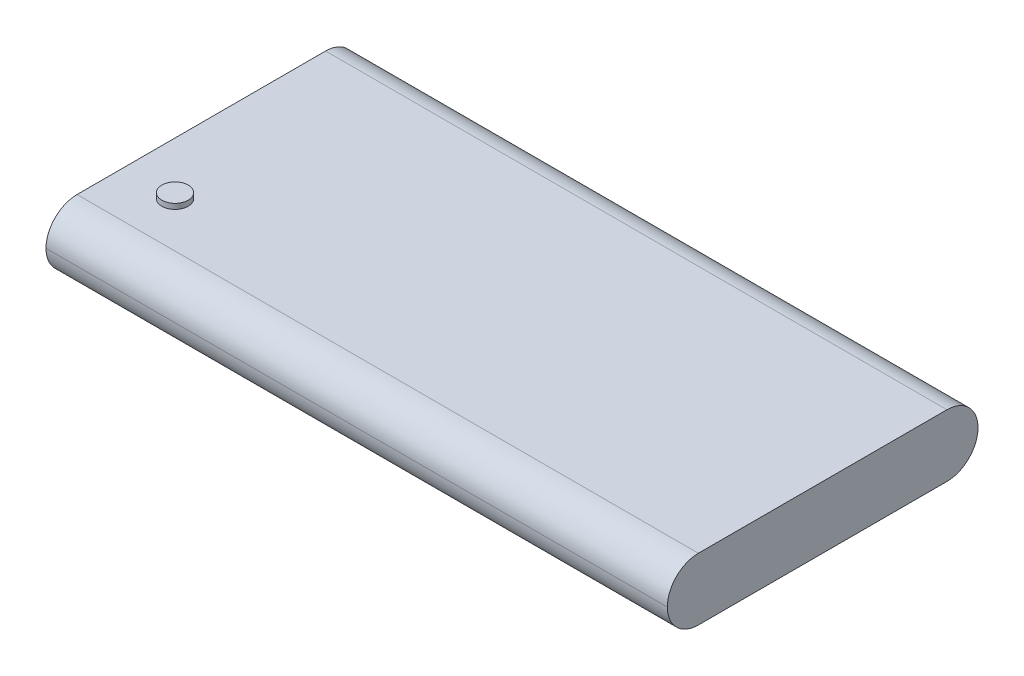
ISO-10303-21;
HEADER;
FILE_DESCRIPTION(('STEP AP214'),'2;1');
FILE_NAME('part.step','',(''),(''),'','','');
FILE_SCHEMA(('AUTOMOTIVE_DESIGN { 1 0 10303 214 1 1 1 1 }'));
ENDSEC;
DATA;
#1=APPLICATION_CONTEXT('core data for automotive mechanical design processes');
#2=APPLICATION_PROTOCOL_DEFINITION('international standard','automotive_design',2000,#1);
#3=PRODUCT_CONTEXT('',#1,'mechanical');
#4=PRODUCT('Part','Part','',(#3));
#5=PRODUCT_RELATED_PRODUCT_CATEGORY('part','',(#4));
#6=PRODUCT_DEFINITION_FORMATION('','',#4);
#7=PRODUCT_DEFINITION_CONTEXT('part definition',#1,'design');
#8=PRODUCT_DEFINITION('design','',#6,#7);
#9=PRODUCT_DEFINITION_SHAPE('','',#8);
#10=(LENGTH_UNIT() NAMED_UNIT(*) SI_UNIT(.MILLI.,.METRE.));
#11=(NAMED_UNIT(*) PLANE_ANGLE_UNIT() SI_UNIT($,.RADIAN.));
#12=(NAMED_UNIT(*) SI_UNIT($,.STERADIAN.) SOLID_ANGLE_UNIT());
#13=UNCERTAINTY_MEASURE_WITH_UNIT(LENGTH_MEASURE(1.E-05),#10,'distance_accuracy_value','');
#14=(GEOMETRIC_REPRESENTATION_CONTEXT(3) GLOBAL_UNCERTAINTY_ASSIGNED_CONTEXT((#13)) GLOBAL_UNIT_ASSIGNED_CONTEXT((#10,
#11,#12)) REPRESENTATION_CONTEXT('',''));
#15=CARTESIAN_POINT('',(0.,0.,0.));
#16=DIRECTION('',(0.,0.,1.));
#17=DIRECTION('',(1.,0.,0.));
#18=AXIS2_PLACEMENT_3D('',#15,#16,#17);
#19=CARTESIAN_POINT('',(75.,7.5,37.5));
#20=DIRECTION('',(-1.,0.,0.));
#21=DIRECTION('',(0.,0.,1.));
#22=AXIS2_PLACEMENT_3D('',#19,#20,#21);
#23=PLANE('',#22);
#24=DIRECTION('',(0.,0.,-1.));
#25=VECTOR('',#24,1.);
#26=CARTESIAN_POINT('',(75.,-7.5,37.5));
#27=LINE('',#26,#25);
#28=CARTESIAN_POINT('',(75.,-7.5,30.));
#29=VERTEX_POINT('',#28);
#30=CARTESIAN_POINT('',(75.,-7.5,-30.));
#31=VERTEX_POINT('',#30);
#32=EDGE_CURVE('E108',#29,#31,#27,.T.);
#33=ORIENTED_EDGE('',*,*,#32,.T.);
#34=CARTESIAN_POINT('',(75.,0.,-30.));
#35=DIRECTION('',(-1.,0.,0.));
#36=DIRECTION('',(0.,0.,1.));
#37=AXIS2_PLACEMENT_3D('',#34,#35,#36);
#38=CIRCLE('',#37,7.5);
#39=CARTESIAN_POINT('',(75.,0.,-37.5));
#40=VERTEX_POINT('',#39);
#41=EDGE_CURVE('E111',#31,#40,#38,.F.);
#42=ORIENTED_EDGE('',*,*,#41,.T.);
#43=CARTESIAN_POINT('',(75.,0.,-30.));
#44=DIRECTION('',(-1.,0.,0.));
#45=DIRECTION('',(0.,0.,1.));
#46=AXIS2_PLACEMENT_3D('',#43,#44,#45);
#47=CIRCLE('',#46,7.5);
#48=CARTESIAN_POINT('',(75.,7.5,-30.));
#49=VERTEX_POINT('',#48);
#50=EDGE_CURVE('E54',#40,#49,#47,.F.);
#51=ORIENTED_EDGE('',*,*,#50,.T.);
#52=DIRECTION('',(0.,0.,-1.));
#53=VECTOR('',#52,1.);
#54=CARTESIAN_POINT('',(75.,7.5,37.5));
#55=LINE('',#54,#53);
#56=CARTESIAN_POINT('',(75.,7.5,30.));
#57=VERTEX_POINT('',#56);
#58=EDGE_CURVE('E107',#57,#49,#55,.T.);
#59=ORIENTED_EDGE('',*,*,#58,.F.);
#60=CARTESIAN_POINT('',(75.,0.,30.));
#61=DIRECTION('',(-1.,0.,0.));
#62=DIRECTION('',(0.,0.,1.));
#63=AXIS2_PLACEMENT_3D('',#60,#61,#62);
#64=CIRCLE('',#63,7.5);
#65=CARTESIAN_POINT('',(75.,0.,37.5));
#66=VERTEX_POINT('',#65);
#67=EDGE_CURVE('E48',#57,#66,#64,.F.);
#68=ORIENTED_EDGE('',*,*,#67,.T.);
#69=CARTESIAN_POINT('',(75.,0.,30.));
#70=DIRECTION('',(-1.,0.,0.));
#71=DIRECTION('',(0.,0.,1.));
#72=AXIS2_PLACEMENT_3D('',#69,#70,#71);
#73=CIRCLE('',#72,7.5);
#74=EDGE_CURVE('E113',#66,#29,#73,.F.);
#75=ORIENTED_EDGE('',*,*,#74,.T.);
#76=EDGE_LOOP('',(#33,#42,#51,#59,#68,#75));
#77=FACE_BOUND('',#76,.T.);
#78=ADVANCED_FACE('F33',(#77),#23,.F.);
#79=CARTESIAN_POINT('',(-75.,7.5,37.5));
#80=DIRECTION('',(1.,0.,0.));
#81=DIRECTION('',(0.,0.,-1.));
#82=AXIS2_PLACEMENT_3D('',#79,#80,#81);
#83=PLANE('',#82);
#84=CARTESIAN_POINT('',(-75.,0.,-30.));
#85=DIRECTION('',(1.,0.,0.));
#86=DIRECTION('',(0.,0.,-1.));
#87=AXIS2_PLACEMENT_3D('',#84,#85,#86);
#88=CIRCLE('',#87,7.5);
#89=CARTESIAN_POINT('',(-75.,7.5,-30.));
#90=VERTEX_POINT('',#89);
#91=CARTESIAN_POINT('',(-75.,0.,-37.5));
#92=VERTEX_POINT('',#91);
#93=EDGE_CURVE('E92',#90,#92,#88,.F.);
#94=ORIENTED_EDGE('',*,*,#93,.T.);
#95=CARTESIAN_POINT('',(-75.,0.,-30.));
#96=DIRECTION('',(1.,0.,0.));
#97=DIRECTION('',(0.,0.,-1.));
#98=AXIS2_PLACEMENT_3D('',#95,#96,#97);
#99=CIRCLE('',#98,7.5);
#100=CARTESIAN_POINT('',(-75.,-7.5,-30.));
#101=VERTEX_POINT('',#100);
#102=EDGE_CURVE('E86',#92,#101,#99,.F.);
#103=ORIENTED_EDGE('',*,*,#102,.T.);
#104=DIRECTION('',(0.,0.,1.));
#105=VECTOR('',#104,1.);
#106=CARTESIAN_POINT('',(-75.,-7.5,37.5));
#107=LINE('',#106,#105);
#108=CARTESIAN_POINT('',(-75.,-7.5,30.));
#109=VERTEX_POINT('',#108);
#110=EDGE_CURVE('E89',#101,#109,#107,.T.);
#111=ORIENTED_EDGE('',*,*,#110,.T.);
#112=CARTESIAN_POINT('',(-75.,0.,30.));
#113=DIRECTION('',(1.,0.,0.));
#114=DIRECTION('',(0.,0.,-1.));
#115=AXIS2_PLACEMENT_3D('',#112,#113,#114);
#116=CIRCLE('',#115,7.5);
#117=CARTESIAN_POINT('',(-75.,0.,37.5));
#118=VERTEX_POINT('',#117);
#119=EDGE_CURVE('E141',#109,#118,#116,.F.);
#120=ORIENTED_EDGE('',*,*,#119,.T.);
#121=CARTESIAN_POINT('',(-75.,0.,30.));
#122=DIRECTION('',(1.,0.,0.));
#123=DIRECTION('',(0.,0.,-1.));
#124=AXIS2_PLACEMENT_3D('',#121,#122,#123);
#125=CIRCLE('',#124,7.5);
#126=CARTESIAN_POINT('',(-75.,7.5,30.));
#127=VERTEX_POINT('',#126);
#128=EDGE_CURVE('E138',#118,#127,#125,.F.);
#129=ORIENTED_EDGE('',*,*,#128,.T.);
#130=DIRECTION('',(0.,0.,1.));
#131=VECTOR('',#130,1.);
#132=CARTESIAN_POINT('',(-75.,7.5,37.5));
#133=LINE('',#132,#131);
#134=EDGE_CURVE('E135',#90,#127,#133,.T.);
#135=ORIENTED_EDGE('',*,*,#134,.F.);
#136=EDGE_LOOP('',(#94,#103,#111,#120,#129,#135));
#137=FACE_BOUND('',#136,.T.);
#138=ADVANCED_FACE('F88',(#137),#83,.F.);
#139=CARTESIAN_POINT('',(0.,7.5,0.));
#140=DIRECTION('',(0.,-1.,0.));
#141=DIRECTION('',(0.,0.,-1.));
#142=AXIS2_PLACEMENT_3D('',#139,#140,#141);
#143=PLANE('',#142);
#144=CARTESIAN_POINT('',(-62.3,7.5,19.05));
#145=DIRECTION('',(0.,-1.,0.));
#146=DIRECTION('',(0.,0.,-1.));
#147=AXIS2_PLACEMENT_3D('',#144,#145,#146);
#148=CIRCLE('',#147,3.175);
#149=CARTESIAN_POINT('',(-62.3,7.5,15.875));
#150=VERTEX_POINT('',#149);
#151=EDGE_CURVE('E11',#150,#150,#148,.F.);
#152=ORIENTED_EDGE('',*,*,#151,.F.);
#153=EDGE_LOOP('',(#152));
#154=FACE_BOUND('',#153,.T.);
#155=ORIENTED_EDGE('',*,*,#58,.T.);
#156=DIRECTION('',(-1.,0.,0.));
#157=VECTOR('',#156,1.);
#158=CARTESIAN_POINT('',(0.,7.5,-30.));
#159=LINE('',#158,#157);
#160=EDGE_CURVE('E41',#49,#90,#159,.T.);
#161=ORIENTED_EDGE('',*,*,#160,.T.);
#162=ORIENTED_EDGE('',*,*,#134,.T.);
#163=DIRECTION('',(1.,0.,0.));
#164=VECTOR('',#163,1.);
#165=CARTESIAN_POINT('',(0.,7.5,30.));
#166=LINE('',#165,#164);
#167=EDGE_CURVE('E120',#127,#57,#166,.T.);
#168=ORIENTED_EDGE('',*,*,#167,.T.);
#169=EDGE_LOOP('',(#155,#161,#162,#168));
#170=FACE_BOUND('',#169,.T.);
#171=ADVANCED_FACE('F147',(#154,#170),#143,.F.);
#172=CARTESIAN_POINT('',(0.,-7.5,0.));
#173=DIRECTION('',(0.,-1.,0.));
#174=DIRECTION('',(0.,0.,-1.));
#175=AXIS2_PLACEMENT_3D('',#172,#173,#174);
#176=PLANE('',#175);
#177=ORIENTED_EDGE('',*,*,#110,.F.);
#178=DIRECTION('',(-1.,0.,0.));
#179=VECTOR('',#178,1.);
#180=CARTESIAN_POINT('',(75.,-7.5,-30.));
#181=LINE('',#180,#179);
#182=EDGE_CURVE('E104',#101,#31,#181,.F.);
#183=ORIENTED_EDGE('',*,*,#182,.T.);
#184=ORIENTED_EDGE('',*,*,#32,.F.);
#185=DIRECTION('',(1.,0.,0.));
#186=VECTOR('',#185,1.);
#187=CARTESIAN_POINT('',(-75.,-7.5,30.));
#188=LINE('',#187,#186);
#189=EDGE_CURVE('E97',#29,#109,#188,.F.);
#190=ORIENTED_EDGE('',*,*,#189,.T.);
#191=EDGE_LOOP('',(#177,#183,#184,#190));
#192=FACE_BOUND('',#191,.T.);
#193=ADVANCED_FACE('F102',(#192),#176,.T.);
#194=CARTESIAN_POINT('',(0.,0.,-30.));
#195=DIRECTION('',(-1.,0.,0.));
#196=DIRECTION('',(0.,0.,1.));
#197=AXIS2_PLACEMENT_3D('',#194,#195,#196);
#198=CYLINDRICAL_SURFACE('',#197,7.5);
#199=ORIENTED_EDGE('',*,*,#160,.F.);
#200=ORIENTED_EDGE('',*,*,#50,.F.);
#201=DIRECTION('',(-1.,0.,0.));
#202=VECTOR('',#201,1.);
#203=CARTESIAN_POINT('',(-75.,0.,-37.5));
#204=LINE('',#203,#202);
#205=EDGE_CURVE('E123',#92,#40,#204,.F.);
#206=ORIENTED_EDGE('',*,*,#205,.F.);
#207=ORIENTED_EDGE('',*,*,#93,.F.);
#208=EDGE_LOOP('',(#199,#200,#206,#207));
#209=FACE_BOUND('',#208,.T.);
#210=ADVANCED_FACE('F159',(#209),#198,.T.);
#211=CARTESIAN_POINT('',(-75.,0.,-30.));
#212=DIRECTION('',(1.,0.,0.));
#213=DIRECTION('',(0.,0.,-1.));
#214=AXIS2_PLACEMENT_3D('',#211,#212,#213);
#215=CYLINDRICAL_SURFACE('',#214,7.5);
#216=ORIENTED_EDGE('',*,*,#41,.F.);
#217=ORIENTED_EDGE('',*,*,#182,.F.);
#218=ORIENTED_EDGE('',*,*,#102,.F.);
#219=ORIENTED_EDGE('',*,*,#205,.T.);
#220=EDGE_LOOP('',(#216,#217,#218,#219));
#221=FACE_BOUND('',#220,.T.);
#222=ADVANCED_FACE('F110',(#221),#215,.T.);
#223=CARTESIAN_POINT('',(0.,0.,30.));
#224=DIRECTION('',(1.,0.,0.));
#225=DIRECTION('',(0.,0.,-1.));
#226=AXIS2_PLACEMENT_3D('',#223,#224,#225);
#227=CYLINDRICAL_SURFACE('',#226,7.5);
#228=ORIENTED_EDGE('',*,*,#167,.F.);
#229=ORIENTED_EDGE('',*,*,#128,.F.);
#230=DIRECTION('',(1.,0.,0.));
#231=VECTOR('',#230,1.);
#232=CARTESIAN_POINT('',(-75.,0.,37.5));
#233=LINE('',#232,#231);
#234=EDGE_CURVE('E124',#66,#118,#233,.F.);
#235=ORIENTED_EDGE('',*,*,#234,.F.);
#236=ORIENTED_EDGE('',*,*,#67,.F.);
#237=EDGE_LOOP('',(#228,#229,#235,#236));
#238=FACE_BOUND('',#237,.T.);
#239=ADVANCED_FACE('F35',(#238),#227,.T.);
#240=CARTESIAN_POINT('',(-75.,0.,30.));
#241=DIRECTION('',(-1.,0.,0.));
#242=DIRECTION('',(0.,0.,1.));
#243=AXIS2_PLACEMENT_3D('',#240,#241,#242);
#244=CYLINDRICAL_SURFACE('',#243,7.5);
#245=ORIENTED_EDGE('',*,*,#119,.F.);
#246=ORIENTED_EDGE('',*,*,#189,.F.);
#247=ORIENTED_EDGE('',*,*,#74,.F.);
#248=ORIENTED_EDGE('',*,*,#234,.T.);
#249=EDGE_LOOP('',(#245,#246,#247,#248));
#250=FACE_BOUND('',#249,.T.);
#251=ADVANCED_FACE('F162',(#250),#244,.T.);
#252=CARTESIAN_POINT('',(-62.3,8.77,19.05));
#253=DIRECTION('',(0.,-1.,0.));
#254=DIRECTION('',(0.,0.,-1.));
#255=AXIS2_PLACEMENT_3D('',#252,#253,#254);
#256=CYLINDRICAL_SURFACE('',#255,3.175);
#257=CARTESIAN_POINT('',(-62.3,8.77,19.05));
#258=DIRECTION('',(0.,1.,0.));
#259=DIRECTION('',(0.,0.,1.));
#260=AXIS2_PLACEMENT_3D('',#257,#258,#259);
#261=CIRCLE('',#260,3.175);
#262=CARTESIAN_POINT('',(-62.3,8.77,22.225));
#263=VERTEX_POINT('',#262);
#264=EDGE_CURVE('E126',#263,#263,#261,.T.);
#265=ORIENTED_EDGE('',*,*,#264,.F.);
#266=EDGE_LOOP('',(#265));
#267=FACE_BOUND('',#266,.T.);
#268=ORIENTED_EDGE('',*,*,#151,.T.);
#269=EDGE_LOOP('',(#268));
#270=FACE_BOUND('',#269,.T.);
#271=ADVANCED_FACE('F164',(#267,#270),#256,.T.);
#272=CARTESIAN_POINT('',(-62.3,8.77,19.05));
#273=DIRECTION('',(0.,1.,0.));
#274=DIRECTION('',(0.,0.,1.));
#275=AXIS2_PLACEMENT_3D('',#272,#273,#274);
#276=PLANE('',#275);
#277=ORIENTED_EDGE('',*,*,#264,.T.);
#278=EDGE_LOOP('',(#277));
#279=FACE_BOUND('',#278,.T.);
#280=ADVANCED_FACE('F169',(#279),#276,.T.);
#281=CLOSED_SHELL('',(#78,#138,#171,#193,#210,#222,#239,#251,#271,#280));
#282=MANIFOLD_SOLID_BREP('B2',#281);
#283=ADVANCED_BREP_SHAPE_REPRESENTATION('',(#18,#282),#14);
#284=SHAPE_DEFINITION_REPRESENTATION(#9,#283);
ENDSEC;
END-ISO-10303-21;
